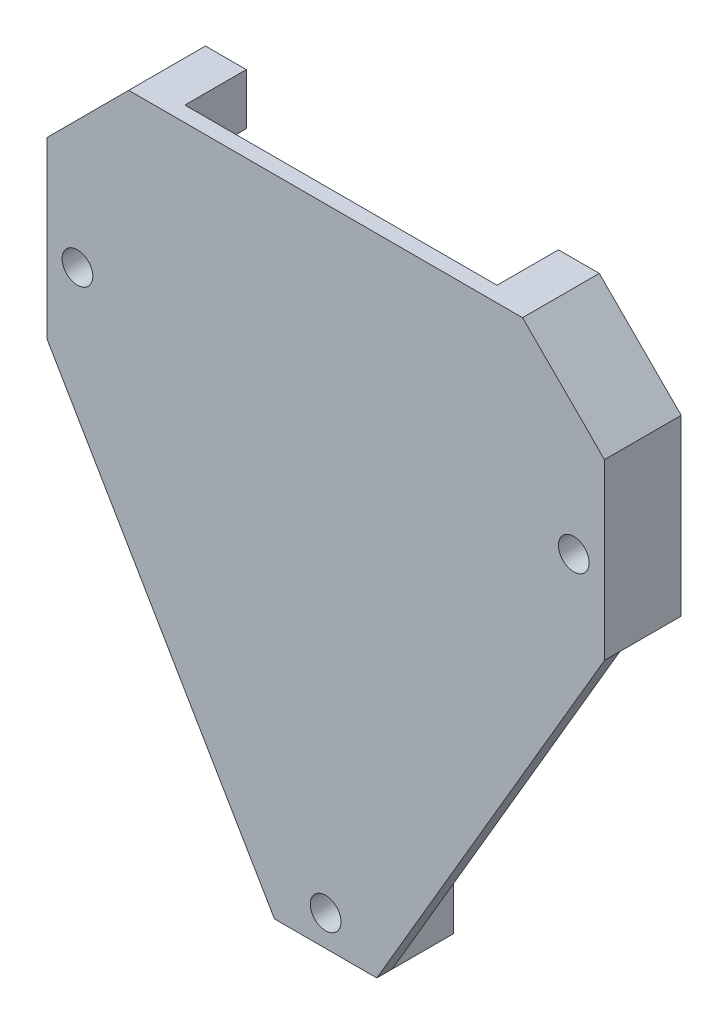
ISO-10303-21;
HEADER;
FILE_DESCRIPTION(('STEP AP214'),'2;1');
FILE_NAME('part.step','',(''),(''),'','','');
FILE_SCHEMA(('AUTOMOTIVE_DESIGN { 1 0 10303 214 1 1 1 1 }'));
ENDSEC;
DATA;
#1=APPLICATION_CONTEXT('core data for automotive mechanical design processes');
#2=APPLICATION_PROTOCOL_DEFINITION('international standard','automotive_design',2000,#1);
#3=PRODUCT_CONTEXT('',#1,'mechanical');
#4=PRODUCT('Part','Part','',(#3));
#5=PRODUCT_RELATED_PRODUCT_CATEGORY('part','',(#4));
#6=PRODUCT_DEFINITION_FORMATION('','',#4);
#7=PRODUCT_DEFINITION_CONTEXT('part definition',#1,'design');
#8=PRODUCT_DEFINITION('design','',#6,#7);
#9=PRODUCT_DEFINITION_SHAPE('','',#8);
#10=(LENGTH_UNIT() NAMED_UNIT(*) SI_UNIT(.MILLI.,.METRE.));
#11=(NAMED_UNIT(*) PLANE_ANGLE_UNIT() SI_UNIT($,.RADIAN.));
#12=(NAMED_UNIT(*) SI_UNIT($,.STERADIAN.) SOLID_ANGLE_UNIT());
#13=UNCERTAINTY_MEASURE_WITH_UNIT(LENGTH_MEASURE(1.E-05),#10,'distance_accuracy_value','');
#14=(GEOMETRIC_REPRESENTATION_CONTEXT(3) GLOBAL_UNCERTAINTY_ASSIGNED_CONTEXT((#13)) GLOBAL_UNIT_ASSIGNED_CONTEXT((#10,
#11,#12)) REPRESENTATION_CONTEXT('',''));
#15=CARTESIAN_POINT('',(0.,0.,0.));
#16=DIRECTION('',(0.,0.,1.));
#17=DIRECTION('',(1.,0.,0.));
#18=AXIS2_PLACEMENT_3D('',#15,#16,#17);
#19=CARTESIAN_POINT('',(0.,0.,6.));
#20=DIRECTION('',(0.,0.,1.));
#21=DIRECTION('',(1.,0.,0.));
#22=AXIS2_PLACEMENT_3D('',#19,#20,#21);
#23=PLANE('',#22);
#24=DIRECTION('',(0.,1.,0.));
#25=VECTOR('',#24,1.);
#26=CARTESIAN_POINT('',(60.,270.,6.));
#27=LINE('',#26,#25);
#28=CARTESIAN_POINT('',(60.,263.,6.));
#29=VERTEX_POINT('',#28);
#30=CARTESIAN_POINT('',(60.,270.,6.));
#31=VERTEX_POINT('',#30);
#32=EDGE_CURVE('E224',#29,#31,#27,.T.);
#33=ORIENTED_EDGE('',*,*,#32,.T.);
#34=DIRECTION('',(-1.,0.,0.));
#35=VECTOR('',#34,1.);
#36=CARTESIAN_POINT('',(50.,270.,6.));
#37=LINE('',#36,#35);
#38=CARTESIAN_POINT('',(50.,270.,6.));
#39=VERTEX_POINT('',#38);
#40=EDGE_CURVE('E212',#31,#39,#37,.T.);
#41=ORIENTED_EDGE('',*,*,#40,.T.);
#42=DIRECTION('',(0.,-1.,0.));
#43=VECTOR('',#42,1.);
#44=CARTESIAN_POINT('',(50.,270.,6.));
#45=LINE('',#44,#43);
#46=CARTESIAN_POINT('',(50.,263.,6.));
#47=VERTEX_POINT('',#46);
#48=EDGE_CURVE('E223',#39,#47,#45,.T.);
#49=ORIENTED_EDGE('',*,*,#48,.T.);
#50=DIRECTION('',(0.505282330665257,-0.862954092821562,0.));
#51=VECTOR('',#50,1.);
#52=CARTESIAN_POINT('',(27.75,301.,6.));
#53=LINE('',#52,#51);
#54=CARTESIAN_POINT('',(27.75,301.,6.));
#55=VERTEX_POINT('',#54);
#56=EDGE_CURVE('E327',#55,#47,#53,.T.);
#57=ORIENTED_EDGE('',*,*,#56,.F.);
#58=DIRECTION('',(1.,0.,0.));
#59=VECTOR('',#58,1.);
#60=CARTESIAN_POINT('',(27.75,301.,6.));
#61=LINE('',#60,#59);
#62=CARTESIAN_POINT('',(35.,301.,6.));
#63=VERTEX_POINT('',#62);
#64=EDGE_CURVE('E378',#55,#63,#61,.T.);
#65=ORIENTED_EDGE('',*,*,#64,.T.);
#66=DIRECTION('',(0.,1.,0.));
#67=VECTOR('',#66,1.);
#68=CARTESIAN_POINT('',(35.,321.,6.));
#69=LINE('',#68,#67);
#70=CARTESIAN_POINT('',(35.,321.,6.));
#71=VERTEX_POINT('',#70);
#72=EDGE_CURVE('E382',#63,#71,#69,.T.);
#73=ORIENTED_EDGE('',*,*,#72,.T.);
#74=DIRECTION('',(1.,0.,0.));
#75=VECTOR('',#74,1.);
#76=CARTESIAN_POINT('',(39.75,321.,6.));
#77=LINE('',#76,#75);
#78=CARTESIAN_POINT('',(39.75,321.,6.));
#79=VERTEX_POINT('',#78);
#80=EDGE_CURVE('E386',#71,#79,#77,.T.);
#81=ORIENTED_EDGE('',*,*,#80,.T.);
#82=DIRECTION('',(0.,1.,0.));
#83=VECTOR('',#82,1.);
#84=CARTESIAN_POINT('',(39.75,326.,6.));
#85=LINE('',#84,#83);
#86=CARTESIAN_POINT('',(39.75,326.,6.));
#87=VERTEX_POINT('',#86);
#88=EDGE_CURVE('E390',#79,#87,#85,.T.);
#89=ORIENTED_EDGE('',*,*,#88,.T.);
#90=DIRECTION('',(-1.,0.,0.));
#91=VECTOR('',#90,1.);
#92=CARTESIAN_POINT('',(39.75,326.,6.));
#93=LINE('',#92,#91);
#94=CARTESIAN_POINT('',(70.25,326.,6.));
#95=VERTEX_POINT('',#94);
#96=EDGE_CURVE('E350',#95,#87,#93,.T.);
#97=ORIENTED_EDGE('',*,*,#96,.F.);
#98=DIRECTION('',(0.,-1.,0.));
#99=VECTOR('',#98,1.);
#100=CARTESIAN_POINT('',(70.25,326.,6.));
#101=LINE('',#100,#99);
#102=CARTESIAN_POINT('',(70.25,321.,6.));
#103=VERTEX_POINT('',#102);
#104=EDGE_CURVE('E260',#95,#103,#101,.T.);
#105=ORIENTED_EDGE('',*,*,#104,.T.);
#106=DIRECTION('',(1.,0.,0.));
#107=VECTOR('',#106,1.);
#108=CARTESIAN_POINT('',(70.25,321.,6.));
#109=LINE('',#108,#107);
#110=CARTESIAN_POINT('',(75.,321.,6.));
#111=VERTEX_POINT('',#110);
#112=EDGE_CURVE('E264',#103,#111,#109,.T.);
#113=ORIENTED_EDGE('',*,*,#112,.T.);
#114=DIRECTION('',(0.,-1.,0.));
#115=VECTOR('',#114,1.);
#116=CARTESIAN_POINT('',(75.,321.,6.));
#117=LINE('',#116,#115);
#118=CARTESIAN_POINT('',(75.,301.,6.));
#119=VERTEX_POINT('',#118);
#120=EDGE_CURVE('E269',#111,#119,#117,.T.);
#121=ORIENTED_EDGE('',*,*,#120,.T.);
#122=DIRECTION('',(1.,0.,0.));
#123=VECTOR('',#122,1.);
#124=CARTESIAN_POINT('',(82.25,301.,6.));
#125=LINE('',#124,#123);
#126=CARTESIAN_POINT('',(82.25,301.,6.));
#127=VERTEX_POINT('',#126);
#128=EDGE_CURVE('E273',#119,#127,#125,.T.);
#129=ORIENTED_EDGE('',*,*,#128,.T.);
#130=DIRECTION('',(0.505282330665257,0.862954092821562,0.));
#131=VECTOR('',#130,1.);
#132=CARTESIAN_POINT('',(60.,263.,6.));
#133=LINE('',#132,#131);
#134=EDGE_CURVE('E237',#29,#127,#133,.T.);
#135=ORIENTED_EDGE('',*,*,#134,.F.);
#136=EDGE_LOOP('',(#33,#41,#49,#57,#65,#73,#81,#89,#97,#105,#113,#121,#129,#135));
#137=FACE_BOUND('',#136,.T.);
#138=ADVANCED_FACE('F41',(#137),#23,.F.);
#139=CARTESIAN_POINT('',(0.,0.,0.));
#140=DIRECTION('',(0.,0.,1.));
#141=DIRECTION('',(1.,0.,0.));
#142=AXIS2_PLACEMENT_3D('',#139,#140,#141);
#143=PLANE('',#142);
#144=DIRECTION('',(-1.,0.,0.));
#145=VECTOR('',#144,1.);
#146=CARTESIAN_POINT('',(39.75,326.,0.));
#147=LINE('',#146,#145);
#148=CARTESIAN_POINT('',(39.75,326.,0.));
#149=VERTEX_POINT('',#148);
#150=CARTESIAN_POINT('',(35.7573593128807,326.,0.));
#151=VERTEX_POINT('',#150);
#152=EDGE_CURVE('E377',#149,#151,#147,.T.);
#153=ORIENTED_EDGE('',*,*,#152,.F.);
#154=DIRECTION('',(0.,1.,0.));
#155=VECTOR('',#154,1.);
#156=CARTESIAN_POINT('',(39.75,326.,0.));
#157=LINE('',#156,#155);
#158=CARTESIAN_POINT('',(39.75,321.,0.));
#159=VERTEX_POINT('',#158);
#160=EDGE_CURVE('E100',#159,#149,#157,.T.);
#161=ORIENTED_EDGE('',*,*,#160,.F.);
#162=DIRECTION('',(1.,0.,0.));
#163=VECTOR('',#162,1.);
#164=CARTESIAN_POINT('',(39.75,321.,0.));
#165=LINE('',#164,#163);
#166=CARTESIAN_POINT('',(35.,321.,0.));
#167=VERTEX_POINT('',#166);
#168=EDGE_CURVE('E93',#167,#159,#165,.T.);
#169=ORIENTED_EDGE('',*,*,#168,.F.);
#170=DIRECTION('',(0.,1.,0.));
#171=VECTOR('',#170,1.);
#172=CARTESIAN_POINT('',(35.,321.,0.));
#173=LINE('',#172,#171);
#174=CARTESIAN_POINT('',(35.,301.,0.));
#175=VERTEX_POINT('',#174);
#176=EDGE_CURVE('E407',#175,#167,#173,.T.);
#177=ORIENTED_EDGE('',*,*,#176,.F.);
#178=DIRECTION('',(1.,0.,0.));
#179=VECTOR('',#178,1.);
#180=CARTESIAN_POINT('',(27.75,301.,0.));
#181=LINE('',#180,#179);
#182=CARTESIAN_POINT('',(27.75,301.,0.));
#183=VERTEX_POINT('',#182);
#184=EDGE_CURVE('E404',#183,#175,#181,.T.);
#185=ORIENTED_EDGE('',*,*,#184,.F.);
#186=DIRECTION('',(0.,-1.,0.));
#187=VECTOR('',#186,1.);
#188=CARTESIAN_POINT('',(27.75,317.992640687119,0.));
#189=LINE('',#188,#187);
#190=CARTESIAN_POINT('',(27.75,317.992640687119,0.));
#191=VERTEX_POINT('',#190);
#192=EDGE_CURVE('E401',#191,#183,#189,.T.);
#193=ORIENTED_EDGE('',*,*,#192,.F.);
#194=DIRECTION('',(-0.707106781186549,-0.707106781186546,0.));
#195=VECTOR('',#194,1.);
#196=CARTESIAN_POINT('',(35.7573593128807,326.,0.));
#197=LINE('',#196,#195);
#198=EDGE_CURVE('E398',#151,#191,#197,.T.);
#199=ORIENTED_EDGE('',*,*,#198,.F.);
#200=EDGE_LOOP('',(#153,#161,#169,#177,#185,#193,#199));
#201=FACE_BOUND('',#200,.T.);
#202=CARTESIAN_POINT('',(30.75,308.5,0.));
#203=DIRECTION('',(0.,0.,1.));
#204=DIRECTION('',(1.,0.,0.));
#205=AXIS2_PLACEMENT_3D('',#202,#203,#204);
#206=CIRCLE('',#205,1.5);
#207=CARTESIAN_POINT('',(32.25,308.5,0.));
#208=VERTEX_POINT('',#207);
#209=EDGE_CURVE('E373',#208,#208,#206,.T.);
#210=ORIENTED_EDGE('',*,*,#209,.T.);
#211=EDGE_LOOP('',(#210));
#212=FACE_BOUND('',#211,.T.);
#213=ADVANCED_FACE('F439',(#201,#212),#143,.F.);
#214=CARTESIAN_POINT('',(39.75,326.,6.));
#215=DIRECTION('',(0.,-1.,0.));
#216=DIRECTION('',(0.,0.,-1.));
#217=AXIS2_PLACEMENT_3D('',#214,#215,#216);
#218=PLANE('',#217);
#219=ORIENTED_EDGE('',*,*,#152,.T.);
#220=DIRECTION('',(0.,0.,-1.));
#221=VECTOR('',#220,1.);
#222=CARTESIAN_POINT('',(35.7573593128807,326.,6.));
#223=LINE('',#222,#221);
#224=CARTESIAN_POINT('',(35.7573593128807,326.,7.5));
#225=VERTEX_POINT('',#224);
#226=EDGE_CURVE('E50',#225,#151,#223,.T.);
#227=ORIENTED_EDGE('',*,*,#226,.F.);
#228=DIRECTION('',(-1.,0.,0.));
#229=VECTOR('',#228,1.);
#230=CARTESIAN_POINT('',(74.2426406871192,326.,7.5));
#231=LINE('',#230,#229);
#232=CARTESIAN_POINT('',(74.2426406871192,326.,7.5));
#233=VERTEX_POINT('',#232);
#234=EDGE_CURVE('E332',#233,#225,#231,.T.);
#235=ORIENTED_EDGE('',*,*,#234,.F.);
#236=DIRECTION('',(0.,0.,-1.));
#237=VECTOR('',#236,1.);
#238=CARTESIAN_POINT('',(74.2426406871192,326.,7.5));
#239=LINE('',#238,#237);
#240=CARTESIAN_POINT('',(74.2426406871192,326.,0.));
#241=VERTEX_POINT('',#240);
#242=EDGE_CURVE('E365',#233,#241,#239,.T.);
#243=ORIENTED_EDGE('',*,*,#242,.T.);
#244=DIRECTION('',(-1.,0.,0.));
#245=VECTOR('',#244,1.);
#246=CARTESIAN_POINT('',(70.25,326.,0.));
#247=LINE('',#246,#245);
#248=CARTESIAN_POINT('',(70.25,326.,0.));
#249=VERTEX_POINT('',#248);
#250=EDGE_CURVE('E282',#241,#249,#247,.T.);
#251=ORIENTED_EDGE('',*,*,#250,.T.);
#252=DIRECTION('',(0.,0.,-1.));
#253=VECTOR('',#252,1.);
#254=CARTESIAN_POINT('',(70.25,326.,6.));
#255=LINE('',#254,#253);
#256=EDGE_CURVE('E309',#95,#249,#255,.T.);
#257=ORIENTED_EDGE('',*,*,#256,.F.);
#258=ORIENTED_EDGE('',*,*,#96,.T.);
#259=DIRECTION('',(0.,0.,-1.));
#260=VECTOR('',#259,1.);
#261=CARTESIAN_POINT('',(39.75,326.,6.));
#262=LINE('',#261,#260);
#263=EDGE_CURVE('E394',#87,#149,#262,.T.);
#264=ORIENTED_EDGE('',*,*,#263,.T.);
#265=EDGE_LOOP('',(#219,#227,#235,#243,#251,#257,#258,#264));
#266=FACE_BOUND('',#265,.T.);
#267=ADVANCED_FACE('F43',(#266),#218,.F.);
#268=CARTESIAN_POINT('',(35.7573593128807,326.,6.));
#269=DIRECTION('',(0.707106781186546,-0.707106781186549,0.));
#270=DIRECTION('',(0.707106781186549,0.707106781186546,0.));
#271=AXIS2_PLACEMENT_3D('',#268,#269,#270);
#272=PLANE('',#271);
#273=ORIENTED_EDGE('',*,*,#198,.T.);
#274=DIRECTION('',(0.,0.,-1.));
#275=VECTOR('',#274,1.);
#276=CARTESIAN_POINT('',(27.75,317.992640687119,6.));
#277=LINE('',#276,#275);
#278=CARTESIAN_POINT('',(27.75,317.992640687119,7.5));
#279=VERTEX_POINT('',#278);
#280=EDGE_CURVE('E427',#279,#191,#277,.T.);
#281=ORIENTED_EDGE('',*,*,#280,.F.);
#282=DIRECTION('',(-0.707106781186549,-0.707106781186546,0.));
#283=VECTOR('',#282,1.);
#284=CARTESIAN_POINT('',(35.7573593128807,326.,7.5));
#285=LINE('',#284,#283);
#286=EDGE_CURVE('E336',#225,#279,#285,.T.);
#287=ORIENTED_EDGE('',*,*,#286,.F.);
#288=ORIENTED_EDGE('',*,*,#226,.T.);
#289=EDGE_LOOP('',(#273,#281,#287,#288));
#290=FACE_BOUND('',#289,.T.);
#291=ADVANCED_FACE('F434',(#290),#272,.F.);
#292=CARTESIAN_POINT('',(27.75,317.992640687119,6.));
#293=DIRECTION('',(1.,0.,0.));
#294=DIRECTION('',(0.,1.,0.));
#295=AXIS2_PLACEMENT_3D('',#292,#293,#294);
#296=PLANE('',#295);
#297=ORIENTED_EDGE('',*,*,#192,.T.);
#298=DIRECTION('',(0.,0.,-1.));
#299=VECTOR('',#298,1.);
#300=CARTESIAN_POINT('',(27.75,301.,6.));
#301=LINE('',#300,#299);
#302=EDGE_CURVE('E109',#55,#183,#301,.T.);
#303=ORIENTED_EDGE('',*,*,#302,.F.);
#304=DIRECTION('',(0.,0.,-1.));
#305=VECTOR('',#304,1.);
#306=CARTESIAN_POINT('',(27.75,301.,7.5));
#307=LINE('',#306,#305);
#308=CARTESIAN_POINT('',(27.75,301.,7.5));
#309=VERTEX_POINT('',#308);
#310=EDGE_CURVE('E361',#309,#55,#307,.T.);
#311=ORIENTED_EDGE('',*,*,#310,.F.);
#312=DIRECTION('',(0.,-1.,0.));
#313=VECTOR('',#312,1.);
#314=CARTESIAN_POINT('',(27.75,317.992640687119,7.5));
#315=LINE('',#314,#313);
#316=EDGE_CURVE('E340',#279,#309,#315,.T.);
#317=ORIENTED_EDGE('',*,*,#316,.F.);
#318=ORIENTED_EDGE('',*,*,#280,.T.);
#319=EDGE_LOOP('',(#297,#303,#311,#317,#318));
#320=FACE_BOUND('',#319,.T.);
#321=ADVANCED_FACE('F444',(#320),#296,.F.);
#322=CARTESIAN_POINT('',(27.75,301.,6.));
#323=DIRECTION('',(0.,1.,0.));
#324=DIRECTION('',(0.,0.,1.));
#325=AXIS2_PLACEMENT_3D('',#322,#323,#324);
#326=PLANE('',#325);
#327=ORIENTED_EDGE('',*,*,#184,.T.);
#328=DIRECTION('',(0.,0.,-1.));
#329=VECTOR('',#328,1.);
#330=CARTESIAN_POINT('',(35.,301.,6.));
#331=LINE('',#330,#329);
#332=EDGE_CURVE('E421',#63,#175,#331,.T.);
#333=ORIENTED_EDGE('',*,*,#332,.F.);
#334=ORIENTED_EDGE('',*,*,#64,.F.);
#335=ORIENTED_EDGE('',*,*,#302,.T.);
#336=EDGE_LOOP('',(#327,#333,#334,#335));
#337=FACE_BOUND('',#336,.T.);
#338=ADVANCED_FACE('F447',(#337),#326,.F.);
#339=CARTESIAN_POINT('',(35.,321.,6.));
#340=DIRECTION('',(-1.,0.,0.));
#341=DIRECTION('',(0.,0.,1.));
#342=AXIS2_PLACEMENT_3D('',#339,#340,#341);
#343=PLANE('',#342);
#344=ORIENTED_EDGE('',*,*,#176,.T.);
#345=DIRECTION('',(0.,0.,-1.));
#346=VECTOR('',#345,1.);
#347=CARTESIAN_POINT('',(35.,321.,6.));
#348=LINE('',#347,#346);
#349=EDGE_CURVE('E418',#71,#167,#348,.T.);
#350=ORIENTED_EDGE('',*,*,#349,.F.);
#351=ORIENTED_EDGE('',*,*,#72,.F.);
#352=ORIENTED_EDGE('',*,*,#332,.T.);
#353=EDGE_LOOP('',(#344,#350,#351,#352));
#354=FACE_BOUND('',#353,.T.);
#355=ADVANCED_FACE('F527',(#354),#343,.F.);
#356=CARTESIAN_POINT('',(39.75,321.,6.));
#357=DIRECTION('',(0.,1.,0.));
#358=DIRECTION('',(0.,0.,1.));
#359=AXIS2_PLACEMENT_3D('',#356,#357,#358);
#360=PLANE('',#359);
#361=ORIENTED_EDGE('',*,*,#168,.T.);
#362=DIRECTION('',(0.,0.,-1.));
#363=VECTOR('',#362,1.);
#364=CARTESIAN_POINT('',(39.75,321.,6.));
#365=LINE('',#364,#363);
#366=EDGE_CURVE('E61',#79,#159,#365,.T.);
#367=ORIENTED_EDGE('',*,*,#366,.F.);
#368=ORIENTED_EDGE('',*,*,#80,.F.);
#369=ORIENTED_EDGE('',*,*,#349,.T.);
#370=EDGE_LOOP('',(#361,#367,#368,#369));
#371=FACE_BOUND('',#370,.T.);
#372=ADVANCED_FACE('F524',(#371),#360,.F.);
#373=CARTESIAN_POINT('',(39.75,326.,6.));
#374=DIRECTION('',(-1.,0.,0.));
#375=DIRECTION('',(0.,0.,1.));
#376=AXIS2_PLACEMENT_3D('',#373,#374,#375);
#377=PLANE('',#376);
#378=ORIENTED_EDGE('',*,*,#160,.T.);
#379=ORIENTED_EDGE('',*,*,#263,.F.);
#380=ORIENTED_EDGE('',*,*,#88,.F.);
#381=ORIENTED_EDGE('',*,*,#366,.T.);
#382=EDGE_LOOP('',(#378,#379,#380,#381));
#383=FACE_BOUND('',#382,.T.);
#384=ADVANCED_FACE('F519',(#383),#377,.F.);
#385=CARTESIAN_POINT('',(30.75,308.5,6.));
#386=DIRECTION('',(0.,0.,-1.));
#387=DIRECTION('',(-1.,0.,0.));
#388=AXIS2_PLACEMENT_3D('',#385,#386,#387);
#389=CYLINDRICAL_SURFACE('',#388,1.5);
#390=ORIENTED_EDGE('',*,*,#209,.F.);
#391=EDGE_LOOP('',(#390));
#392=FACE_BOUND('',#391,.T.);
#393=CARTESIAN_POINT('',(30.75,308.5,7.5));
#394=DIRECTION('',(0.,0.,1.));
#395=DIRECTION('',(1.,0.,0.));
#396=AXIS2_PLACEMENT_3D('',#393,#394,#395);
#397=CIRCLE('',#396,1.5);
#398=CARTESIAN_POINT('',(32.25,308.5,7.5));
#399=VERTEX_POINT('',#398);
#400=EDGE_CURVE('E313',#399,#399,#397,.T.);
#401=ORIENTED_EDGE('',*,*,#400,.T.);
#402=EDGE_LOOP('',(#401));
#403=FACE_BOUND('',#402,.T.);
#404=ADVANCED_FACE('F517',(#392,#403),#389,.F.);
#405=CARTESIAN_POINT('',(0.,0.,7.5));
#406=DIRECTION('',(0.,0.,1.));
#407=DIRECTION('',(1.,0.,0.));
#408=AXIS2_PLACEMENT_3D('',#405,#406,#407);
#409=PLANE('',#408);
#410=CARTESIAN_POINT('',(79.25,308.5,7.5));
#411=DIRECTION('',(0.,0.,1.));
#412=DIRECTION('',(1.,0.,0.));
#413=AXIS2_PLACEMENT_3D('',#410,#411,#412);
#414=CIRCLE('',#413,1.5);
#415=CARTESIAN_POINT('',(80.75,308.5,7.5));
#416=VERTEX_POINT('',#415);
#417=EDGE_CURVE('E317',#416,#416,#414,.T.);
#418=ORIENTED_EDGE('',*,*,#417,.F.);
#419=EDGE_LOOP('',(#418));
#420=FACE_BOUND('',#419,.T.);
#421=DIRECTION('',(0.505282330665257,0.862954092821562,0.));
#422=VECTOR('',#421,1.);
#423=CARTESIAN_POINT('',(60.,263.,7.5));
#424=LINE('',#423,#422);
#425=CARTESIAN_POINT('',(60.,263.,7.5));
#426=VERTEX_POINT('',#425);
#427=CARTESIAN_POINT('',(82.25,301.,7.5));
#428=VERTEX_POINT('',#427);
#429=EDGE_CURVE('E323',#426,#428,#424,.T.);
#430=ORIENTED_EDGE('',*,*,#429,.T.);
#431=DIRECTION('',(0.,1.,0.));
#432=VECTOR('',#431,1.);
#433=CARTESIAN_POINT('',(82.25,301.,7.5));
#434=LINE('',#433,#432);
#435=CARTESIAN_POINT('',(82.25,317.992640687119,7.5));
#436=VERTEX_POINT('',#435);
#437=EDGE_CURVE('E326',#428,#436,#434,.T.);
#438=ORIENTED_EDGE('',*,*,#437,.T.);
#439=DIRECTION('',(-0.707106781186549,0.707106781186546,0.));
#440=VECTOR('',#439,1.);
#441=CARTESIAN_POINT('',(82.25,317.992640687119,7.5));
#442=LINE('',#441,#440);
#443=EDGE_CURVE('E329',#436,#233,#442,.T.);
#444=ORIENTED_EDGE('',*,*,#443,.T.);
#445=ORIENTED_EDGE('',*,*,#234,.T.);
#446=ORIENTED_EDGE('',*,*,#286,.T.);
#447=ORIENTED_EDGE('',*,*,#316,.T.);
#448=DIRECTION('',(0.505282330665257,-0.862954092821562,0.));
#449=VECTOR('',#448,1.);
#450=CARTESIAN_POINT('',(27.75,301.,7.5));
#451=LINE('',#450,#449);
#452=CARTESIAN_POINT('',(50.,263.,7.5));
#453=VERTEX_POINT('',#452);
#454=EDGE_CURVE('E343',#309,#453,#451,.T.);
#455=ORIENTED_EDGE('',*,*,#454,.T.);
#456=DIRECTION('',(1.,0.,0.));
#457=VECTOR('',#456,1.);
#458=CARTESIAN_POINT('',(50.,263.,7.5));
#459=LINE('',#458,#457);
#460=EDGE_CURVE('E346',#453,#426,#459,.T.);
#461=ORIENTED_EDGE('',*,*,#460,.T.);
#462=EDGE_LOOP('',(#430,#438,#444,#445,#446,#447,#455,#461));
#463=FACE_BOUND('',#462,.T.);
#464=CARTESIAN_POINT('',(55.,266.,7.5));
#465=DIRECTION('',(0.,0.,1.));
#466=DIRECTION('',(1.,0.,0.));
#467=AXIS2_PLACEMENT_3D('',#464,#465,#466);
#468=CIRCLE('',#467,1.5);
#469=CARTESIAN_POINT('',(56.5,266.,7.5));
#470=VERTEX_POINT('',#469);
#471=EDGE_CURVE('E320',#470,#470,#468,.T.);
#472=ORIENTED_EDGE('',*,*,#471,.F.);
#473=EDGE_LOOP('',(#472));
#474=FACE_BOUND('',#473,.T.);
#475=ORIENTED_EDGE('',*,*,#400,.F.);
#476=EDGE_LOOP('',(#475));
#477=FACE_BOUND('',#476,.T.);
#478=ADVANCED_FACE('F498',(#420,#463,#474,#477),#409,.T.);
#479=CARTESIAN_POINT('',(60.,263.,7.5));
#480=DIRECTION('',(-0.862954092821562,0.505282330665257,0.));
#481=DIRECTION('',(-0.505282330665257,-0.862954092821562,0.));
#482=AXIS2_PLACEMENT_3D('',#479,#480,#481);
#483=PLANE('',#482);
#484=ORIENTED_EDGE('',*,*,#134,.T.);
#485=DIRECTION('',(0.,0.,-1.));
#486=VECTOR('',#485,1.);
#487=CARTESIAN_POINT('',(82.25,301.,7.5));
#488=LINE('',#487,#486);
#489=EDGE_CURVE('E370',#428,#127,#488,.T.);
#490=ORIENTED_EDGE('',*,*,#489,.F.);
#491=ORIENTED_EDGE('',*,*,#429,.F.);
#492=DIRECTION('',(0.,0.,-1.));
#493=VECTOR('',#492,1.);
#494=CARTESIAN_POINT('',(60.,263.,7.5));
#495=LINE('',#494,#493);
#496=EDGE_CURVE('E348',#426,#29,#495,.T.);
#497=ORIENTED_EDGE('',*,*,#496,.T.);
#498=EDGE_LOOP('',(#484,#490,#491,#497));
#499=FACE_BOUND('',#498,.T.);
#500=ADVANCED_FACE('F512',(#499),#483,.F.);
#501=CARTESIAN_POINT('',(82.25,301.,7.5));
#502=DIRECTION('',(-1.,0.,0.));
#503=DIRECTION('',(0.,0.,1.));
#504=AXIS2_PLACEMENT_3D('',#501,#502,#503);
#505=PLANE('',#504);
#506=ORIENTED_EDGE('',*,*,#489,.T.);
#507=DIRECTION('',(0.,0.,-1.));
#508=VECTOR('',#507,1.);
#509=CARTESIAN_POINT('',(82.25,301.,6.));
#510=LINE('',#509,#508);
#511=CARTESIAN_POINT('',(82.25,301.,0.));
#512=VERTEX_POINT('',#511);
#513=EDGE_CURVE('E275',#127,#512,#510,.T.);
#514=ORIENTED_EDGE('',*,*,#513,.T.);
#515=DIRECTION('',(0.,1.,0.));
#516=VECTOR('',#515,1.);
#517=CARTESIAN_POINT('',(82.25,317.992640687119,0.));
#518=LINE('',#517,#516);
#519=CARTESIAN_POINT('',(82.25,317.992640687119,0.));
#520=VERTEX_POINT('',#519);
#521=EDGE_CURVE('E259',#512,#520,#518,.T.);
#522=ORIENTED_EDGE('',*,*,#521,.T.);
#523=DIRECTION('',(0.,0.,-1.));
#524=VECTOR('',#523,1.);
#525=CARTESIAN_POINT('',(82.25,317.992640687119,7.5));
#526=LINE('',#525,#524);
#527=EDGE_CURVE('E368',#436,#520,#526,.T.);
#528=ORIENTED_EDGE('',*,*,#527,.F.);
#529=ORIENTED_EDGE('',*,*,#437,.F.);
#530=EDGE_LOOP('',(#506,#514,#522,#528,#529));
#531=FACE_BOUND('',#530,.T.);
#532=ADVANCED_FACE('F508',(#531),#505,.F.);
#533=CARTESIAN_POINT('',(82.25,317.992640687119,7.5));
#534=DIRECTION('',(-0.707106781186546,-0.707106781186549,0.));
#535=DIRECTION('',(0.707106781186549,-0.707106781186546,0.));
#536=AXIS2_PLACEMENT_3D('',#533,#534,#535);
#537=PLANE('',#536);
#538=ORIENTED_EDGE('',*,*,#527,.T.);
#539=DIRECTION('',(-0.707106781186549,0.707106781186546,0.));
#540=VECTOR('',#539,1.);
#541=CARTESIAN_POINT('',(74.2426406871192,326.,0.));
#542=LINE('',#541,#540);
#543=EDGE_CURVE('E278',#520,#241,#542,.T.);
#544=ORIENTED_EDGE('',*,*,#543,.T.);
#545=ORIENTED_EDGE('',*,*,#242,.F.);
#546=ORIENTED_EDGE('',*,*,#443,.F.);
#547=EDGE_LOOP('',(#538,#544,#545,#546));
#548=FACE_BOUND('',#547,.T.);
#549=ADVANCED_FACE('F505',(#548),#537,.F.);
#550=CARTESIAN_POINT('',(27.75,301.,7.5));
#551=DIRECTION('',(0.862954092821562,0.505282330665257,0.));
#552=DIRECTION('',(-0.505282330665257,0.862954092821562,0.));
#553=AXIS2_PLACEMENT_3D('',#550,#551,#552);
#554=PLANE('',#553);
#555=ORIENTED_EDGE('',*,*,#56,.T.);
#556=DIRECTION('',(0.,0.,-1.));
#557=VECTOR('',#556,1.);
#558=CARTESIAN_POINT('',(50.,263.,7.5));
#559=LINE('',#558,#557);
#560=EDGE_CURVE('E358',#453,#47,#559,.T.);
#561=ORIENTED_EDGE('',*,*,#560,.F.);
#562=ORIENTED_EDGE('',*,*,#454,.F.);
#563=ORIENTED_EDGE('',*,*,#310,.T.);
#564=EDGE_LOOP('',(#555,#561,#562,#563));
#565=FACE_BOUND('',#564,.T.);
#566=ADVANCED_FACE('F452',(#565),#554,.F.);
#567=CARTESIAN_POINT('',(50.,263.,7.5));
#568=DIRECTION('',(0.,1.,0.));
#569=DIRECTION('',(0.,0.,1.));
#570=AXIS2_PLACEMENT_3D('',#567,#568,#569);
#571=PLANE('',#570);
#572=ORIENTED_EDGE('',*,*,#560,.T.);
#573=DIRECTION('',(0.,0.,-1.));
#574=VECTOR('',#573,1.);
#575=CARTESIAN_POINT('',(50.,263.,6.));
#576=LINE('',#575,#574);
#577=CARTESIAN_POINT('',(50.,263.,0.));
#578=VERTEX_POINT('',#577);
#579=EDGE_CURVE('E253',#47,#578,#576,.T.);
#580=ORIENTED_EDGE('',*,*,#579,.T.);
#581=DIRECTION('',(1.,0.,0.));
#582=VECTOR('',#581,1.);
#583=CARTESIAN_POINT('',(50.,263.,0.));
#584=LINE('',#583,#582);
#585=CARTESIAN_POINT('',(60.,263.,0.));
#586=VERTEX_POINT('',#585);
#587=EDGE_CURVE('E238',#578,#586,#584,.T.);
#588=ORIENTED_EDGE('',*,*,#587,.T.);
#589=DIRECTION('',(0.,0.,-1.));
#590=VECTOR('',#589,1.);
#591=CARTESIAN_POINT('',(60.,263.,6.));
#592=LINE('',#591,#590);
#593=EDGE_CURVE('E247',#29,#586,#592,.T.);
#594=ORIENTED_EDGE('',*,*,#593,.F.);
#595=ORIENTED_EDGE('',*,*,#496,.F.);
#596=ORIENTED_EDGE('',*,*,#460,.F.);
#597=EDGE_LOOP('',(#572,#580,#588,#594,#595,#596));
#598=FACE_BOUND('',#597,.T.);
#599=ADVANCED_FACE('F459',(#598),#571,.F.);
#600=CARTESIAN_POINT('',(55.,266.,7.5));
#601=DIRECTION('',(0.,0.,-1.));
#602=DIRECTION('',(-1.,0.,0.));
#603=AXIS2_PLACEMENT_3D('',#600,#601,#602);
#604=CYLINDRICAL_SURFACE('',#603,1.5);
#605=ORIENTED_EDGE('',*,*,#471,.T.);
#606=EDGE_LOOP('',(#605));
#607=FACE_BOUND('',#606,.T.);
#608=CARTESIAN_POINT('',(55.,266.,0.));
#609=DIRECTION('',(0.,0.,1.));
#610=DIRECTION('',(1.,0.,0.));
#611=AXIS2_PLACEMENT_3D('',#608,#609,#610);
#612=CIRCLE('',#611,1.5);
#613=CARTESIAN_POINT('',(56.5,266.,0.));
#614=VERTEX_POINT('',#613);
#615=EDGE_CURVE('E243',#614,#614,#612,.T.);
#616=ORIENTED_EDGE('',*,*,#615,.F.);
#617=EDGE_LOOP('',(#616));
#618=FACE_BOUND('',#617,.T.);
#619=ADVANCED_FACE('F502',(#607,#618),#604,.F.);
#620=CARTESIAN_POINT('',(79.25,308.5,7.5));
#621=DIRECTION('',(0.,0.,-1.));
#622=DIRECTION('',(-1.,0.,0.));
#623=AXIS2_PLACEMENT_3D('',#620,#621,#622);
#624=CYLINDRICAL_SURFACE('',#623,1.5);
#625=ORIENTED_EDGE('',*,*,#417,.T.);
#626=EDGE_LOOP('',(#625));
#627=FACE_BOUND('',#626,.T.);
#628=CARTESIAN_POINT('',(79.25,308.5,0.));
#629=DIRECTION('',(0.,0.,1.));
#630=DIRECTION('',(1.,0.,0.));
#631=AXIS2_PLACEMENT_3D('',#628,#629,#630);
#632=CIRCLE('',#631,1.5);
#633=CARTESIAN_POINT('',(80.75,308.5,0.));
#634=VERTEX_POINT('',#633);
#635=EDGE_CURVE('E232',#634,#634,#632,.T.);
#636=ORIENTED_EDGE('',*,*,#635,.F.);
#637=EDGE_LOOP('',(#636));
#638=FACE_BOUND('',#637,.T.);
#639=ADVANCED_FACE('F589',(#627,#638),#624,.F.);
#640=CARTESIAN_POINT('',(0.,0.,0.));
#641=DIRECTION('',(0.,0.,-1.));
#642=DIRECTION('',(-1.,0.,0.));
#643=AXIS2_PLACEMENT_3D('',#640,#641,#642);
#644=PLANE('',#643);
#645=ORIENTED_EDGE('',*,*,#521,.F.);
#646=DIRECTION('',(1.,0.,0.));
#647=VECTOR('',#646,1.);
#648=CARTESIAN_POINT('',(82.25,301.,0.));
#649=LINE('',#648,#647);
#650=CARTESIAN_POINT('',(75.,301.,0.));
#651=VERTEX_POINT('',#650);
#652=EDGE_CURVE('E265',#651,#512,#649,.T.);
#653=ORIENTED_EDGE('',*,*,#652,.F.);
#654=DIRECTION('',(0.,-1.,0.));
#655=VECTOR('',#654,1.);
#656=CARTESIAN_POINT('',(75.,321.,0.));
#657=LINE('',#656,#655);
#658=CARTESIAN_POINT('',(75.,321.,0.));
#659=VERTEX_POINT('',#658);
#660=EDGE_CURVE('E291',#659,#651,#657,.T.);
#661=ORIENTED_EDGE('',*,*,#660,.F.);
#662=DIRECTION('',(1.,0.,0.));
#663=VECTOR('',#662,1.);
#664=CARTESIAN_POINT('',(70.25,321.,0.));
#665=LINE('',#664,#663);
#666=CARTESIAN_POINT('',(70.25,321.,0.));
#667=VERTEX_POINT('',#666);
#668=EDGE_CURVE('E288',#667,#659,#665,.T.);
#669=ORIENTED_EDGE('',*,*,#668,.F.);
#670=DIRECTION('',(0.,-1.,0.));
#671=VECTOR('',#670,1.);
#672=CARTESIAN_POINT('',(70.25,326.,0.));
#673=LINE('',#672,#671);
#674=EDGE_CURVE('E285',#249,#667,#673,.T.);
#675=ORIENTED_EDGE('',*,*,#674,.F.);
#676=ORIENTED_EDGE('',*,*,#250,.F.);
#677=ORIENTED_EDGE('',*,*,#543,.F.);
#678=EDGE_LOOP('',(#645,#653,#661,#669,#675,#676,#677));
#679=FACE_BOUND('',#678,.T.);
#680=ORIENTED_EDGE('',*,*,#635,.T.);
#681=EDGE_LOOP('',(#680));
#682=FACE_BOUND('',#681,.T.);
#683=ADVANCED_FACE('F596',(#679,#682),#644,.T.);
#684=CARTESIAN_POINT('',(70.25,326.,6.));
#685=DIRECTION('',(1.,0.,0.));
#686=DIRECTION('',(0.,0.,-1.));
#687=AXIS2_PLACEMENT_3D('',#684,#685,#686);
#688=PLANE('',#687);
#689=ORIENTED_EDGE('',*,*,#674,.T.);
#690=DIRECTION('',(0.,0.,-1.));
#691=VECTOR('',#690,1.);
#692=CARTESIAN_POINT('',(70.25,321.,6.));
#693=LINE('',#692,#691);
#694=EDGE_CURVE('E305',#103,#667,#693,.T.);
#695=ORIENTED_EDGE('',*,*,#694,.F.);
#696=ORIENTED_EDGE('',*,*,#104,.F.);
#697=ORIENTED_EDGE('',*,*,#256,.T.);
#698=EDGE_LOOP('',(#689,#695,#696,#697));
#699=FACE_BOUND('',#698,.T.);
#700=ADVANCED_FACE('F604',(#699),#688,.F.);
#701=CARTESIAN_POINT('',(70.25,321.,6.));
#702=DIRECTION('',(0.,1.,0.));
#703=DIRECTION('',(0.,0.,1.));
#704=AXIS2_PLACEMENT_3D('',#701,#702,#703);
#705=PLANE('',#704);
#706=ORIENTED_EDGE('',*,*,#668,.T.);
#707=DIRECTION('',(0.,0.,-1.));
#708=VECTOR('',#707,1.);
#709=CARTESIAN_POINT('',(75.,321.,6.));
#710=LINE('',#709,#708);
#711=EDGE_CURVE('E301',#111,#659,#710,.T.);
#712=ORIENTED_EDGE('',*,*,#711,.F.);
#713=ORIENTED_EDGE('',*,*,#112,.F.);
#714=ORIENTED_EDGE('',*,*,#694,.T.);
#715=EDGE_LOOP('',(#706,#712,#713,#714));
#716=FACE_BOUND('',#715,.T.);
#717=ADVANCED_FACE('F612',(#716),#705,.F.);
#718=CARTESIAN_POINT('',(75.,321.,6.));
#719=DIRECTION('',(1.,0.,0.));
#720=DIRECTION('',(0.,0.,-1.));
#721=AXIS2_PLACEMENT_3D('',#718,#719,#720);
#722=PLANE('',#721);
#723=ORIENTED_EDGE('',*,*,#660,.T.);
#724=DIRECTION('',(0.,0.,-1.));
#725=VECTOR('',#724,1.);
#726=CARTESIAN_POINT('',(75.,301.,6.));
#727=LINE('',#726,#725);
#728=EDGE_CURVE('E297',#119,#651,#727,.T.);
#729=ORIENTED_EDGE('',*,*,#728,.F.);
#730=ORIENTED_EDGE('',*,*,#120,.F.);
#731=ORIENTED_EDGE('',*,*,#711,.T.);
#732=EDGE_LOOP('',(#723,#729,#730,#731));
#733=FACE_BOUND('',#732,.T.);
#734=ADVANCED_FACE('F620',(#733),#722,.F.);
#735=CARTESIAN_POINT('',(82.25,301.,6.));
#736=DIRECTION('',(0.,1.,0.));
#737=DIRECTION('',(0.,0.,1.));
#738=AXIS2_PLACEMENT_3D('',#735,#736,#737);
#739=PLANE('',#738);
#740=ORIENTED_EDGE('',*,*,#652,.T.);
#741=ORIENTED_EDGE('',*,*,#513,.F.);
#742=ORIENTED_EDGE('',*,*,#128,.F.);
#743=ORIENTED_EDGE('',*,*,#728,.T.);
#744=EDGE_LOOP('',(#740,#741,#742,#743));
#745=FACE_BOUND('',#744,.T.);
#746=ADVANCED_FACE('F465',(#745),#739,.F.);
#747=CARTESIAN_POINT('',(0.,0.,0.));
#748=DIRECTION('',(0.,0.,1.));
#749=DIRECTION('',(1.,0.,0.));
#750=AXIS2_PLACEMENT_3D('',#747,#748,#749);
#751=PLANE('',#750);
#752=DIRECTION('',(0.,1.,0.));
#753=VECTOR('',#752,1.);
#754=CARTESIAN_POINT('',(60.,270.,0.));
#755=LINE('',#754,#753);
#756=CARTESIAN_POINT('',(60.,270.,0.));
#757=VERTEX_POINT('',#756);
#758=EDGE_CURVE('E231',#586,#757,#755,.T.);
#759=ORIENTED_EDGE('',*,*,#758,.F.);
#760=ORIENTED_EDGE('',*,*,#587,.F.);
#761=DIRECTION('',(0.,-1.,0.));
#762=VECTOR('',#761,1.);
#763=CARTESIAN_POINT('',(50.,270.,0.));
#764=LINE('',#763,#762);
#765=CARTESIAN_POINT('',(50.,270.,0.));
#766=VERTEX_POINT('',#765);
#767=EDGE_CURVE('E240',#766,#578,#764,.T.);
#768=ORIENTED_EDGE('',*,*,#767,.F.);
#769=DIRECTION('',(-1.,0.,0.));
#770=VECTOR('',#769,1.);
#771=CARTESIAN_POINT('',(50.,270.,0.));
#772=LINE('',#771,#770);
#773=EDGE_CURVE('E249',#757,#766,#772,.T.);
#774=ORIENTED_EDGE('',*,*,#773,.F.);
#775=EDGE_LOOP('',(#759,#760,#768,#774));
#776=FACE_BOUND('',#775,.T.);
#777=ORIENTED_EDGE('',*,*,#615,.T.);
#778=EDGE_LOOP('',(#777));
#779=FACE_BOUND('',#778,.T.);
#780=ADVANCED_FACE('F462',(#776,#779),#751,.F.);
#781=CARTESIAN_POINT('',(60.,270.,6.));
#782=DIRECTION('',(-1.,0.,0.));
#783=DIRECTION('',(0.,0.,1.));
#784=AXIS2_PLACEMENT_3D('',#781,#782,#783);
#785=PLANE('',#784);
#786=ORIENTED_EDGE('',*,*,#758,.T.);
#787=DIRECTION('',(0.,0.,-1.));
#788=VECTOR('',#787,1.);
#789=CARTESIAN_POINT('',(60.,270.,6.));
#790=LINE('',#789,#788);
#791=EDGE_CURVE('E215',#31,#757,#790,.T.);
#792=ORIENTED_EDGE('',*,*,#791,.F.);
#793=ORIENTED_EDGE('',*,*,#32,.F.);
#794=ORIENTED_EDGE('',*,*,#593,.T.);
#795=EDGE_LOOP('',(#786,#792,#793,#794));
#796=FACE_BOUND('',#795,.T.);
#797=ADVANCED_FACE('F227',(#796),#785,.F.);
#798=CARTESIAN_POINT('',(50.,270.,6.));
#799=DIRECTION('',(0.,-1.,0.));
#800=DIRECTION('',(0.,0.,-1.));
#801=AXIS2_PLACEMENT_3D('',#798,#799,#800);
#802=PLANE('',#801);
#803=CARTESIAN_POINT('',(55.,270.,3.5));
#804=DIRECTION('',(0.,-1.,0.));
#805=DIRECTION('',(0.,0.,-1.));
#806=AXIS2_PLACEMENT_3D('',#803,#804,#805);
#807=CIRCLE('',#806,0.999999999998366);
#808=CARTESIAN_POINT('',(55.,270.,2.50000000000163));
#809=VERTEX_POINT('',#808);
#810=EDGE_CURVE('E11',#809,#809,#807,.F.);
#811=ORIENTED_EDGE('',*,*,#810,.F.);
#812=EDGE_LOOP('',(#811));
#813=FACE_BOUND('',#812,.T.);
#814=ORIENTED_EDGE('',*,*,#773,.T.);
#815=DIRECTION('',(0.,0.,-1.));
#816=VECTOR('',#815,1.);
#817=CARTESIAN_POINT('',(50.,270.,6.));
#818=LINE('',#817,#816);
#819=EDGE_CURVE('E218',#39,#766,#818,.T.);
#820=ORIENTED_EDGE('',*,*,#819,.F.);
#821=ORIENTED_EDGE('',*,*,#40,.F.);
#822=ORIENTED_EDGE('',*,*,#791,.T.);
#823=EDGE_LOOP('',(#814,#820,#821,#822));
#824=FACE_BOUND('',#823,.T.);
#825=ADVANCED_FACE('F214',(#813,#824),#802,.F.);
#826=CARTESIAN_POINT('',(50.,270.,6.));
#827=DIRECTION('',(1.,0.,0.));
#828=DIRECTION('',(0.,0.,-1.));
#829=AXIS2_PLACEMENT_3D('',#826,#827,#828);
#830=PLANE('',#829);
#831=ORIENTED_EDGE('',*,*,#767,.T.);
#832=ORIENTED_EDGE('',*,*,#579,.F.);
#833=ORIENTED_EDGE('',*,*,#48,.F.);
#834=ORIENTED_EDGE('',*,*,#819,.T.);
#835=EDGE_LOOP('',(#831,#832,#833,#834));
#836=FACE_BOUND('',#835,.T.);
#837=ADVANCED_FACE('F455',(#836),#830,.F.);
#838=CARTESIAN_POINT('',(55.,271.5,3.5));
#839=DIRECTION('',(0.,-1.,0.));
#840=DIRECTION('',(0.,0.,-1.));
#841=AXIS2_PLACEMENT_3D('',#838,#839,#840);
#842=CYLINDRICAL_SURFACE('',#841,0.999999999998366);
#843=CARTESIAN_POINT('',(55.,271.5,3.5));
#844=DIRECTION('',(0.,1.,0.));
#845=DIRECTION('',(0.,0.,1.));
#846=AXIS2_PLACEMENT_3D('',#843,#844,#845);
#847=CIRCLE('',#846,0.999999999998366);
#848=CARTESIAN_POINT('',(55.,271.5,4.49999999999837));
#849=VERTEX_POINT('',#848);
#850=EDGE_CURVE('E470',#849,#849,#847,.T.);
#851=ORIENTED_EDGE('',*,*,#850,.F.);
#852=EDGE_LOOP('',(#851));
#853=FACE_BOUND('',#852,.T.);
#854=ORIENTED_EDGE('',*,*,#810,.T.);
#855=EDGE_LOOP('',(#854));
#856=FACE_BOUND('',#855,.T.);
#857=ADVANCED_FACE('F476',(#853,#856),#842,.T.);
#858=CARTESIAN_POINT('',(55.,271.5,3.5));
#859=DIRECTION('',(0.,1.,0.));
#860=DIRECTION('',(0.,0.,1.));
#861=AXIS2_PLACEMENT_3D('',#858,#859,#860);
#862=PLANE('',#861);
#863=ORIENTED_EDGE('',*,*,#850,.T.);
#864=EDGE_LOOP('',(#863));
#865=FACE_BOUND('',#864,.T.);
#866=ADVANCED_FACE('F474',(#865),#862,.T.);
#867=CLOSED_SHELL('',(#138,#213,#267,#291,#321,#338,#355,#372,#384,#404,#478,#500,#532,#549,
#566,#599,#619,#639,#683,#700,#717,#734,#746,#780,#797,#825,#837,#857,#866));
#868=MANIFOLD_SOLID_BREP('B2',#867);
#869=ADVANCED_BREP_SHAPE_REPRESENTATION('',(#18,#868),#14);
#870=SHAPE_DEFINITION_REPRESENTATION(#9,#869);
ENDSEC;
END-ISO-10303-21;
